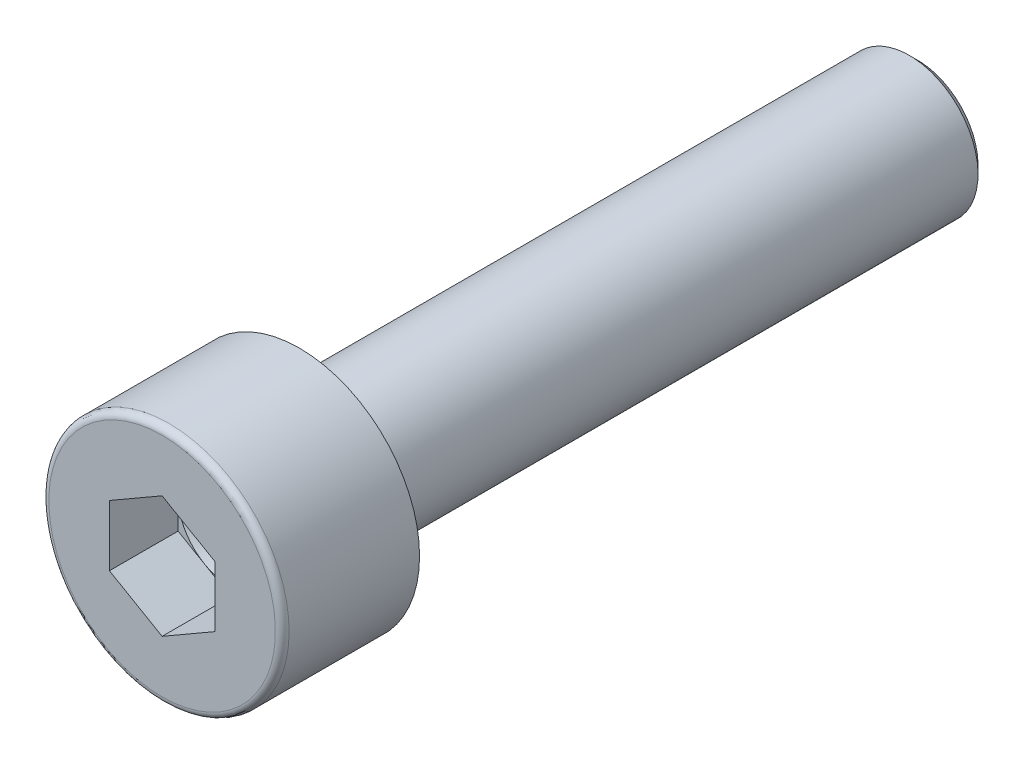
ISO-10303-21;
HEADER;
FILE_DESCRIPTION(('STEP AP214'),'2;1');
FILE_NAME('part.step','',(''),(''),'','','');
FILE_SCHEMA(('AUTOMOTIVE_DESIGN { 1 0 10303 214 1 1 1 1 }'));
ENDSEC;
DATA;
#1=APPLICATION_CONTEXT('core data for automotive mechanical design processes');
#2=APPLICATION_PROTOCOL_DEFINITION('international standard','automotive_design',2000,#1);
#3=PRODUCT_CONTEXT('',#1,'mechanical');
#4=PRODUCT('Part','Part','',(#3));
#5=PRODUCT_RELATED_PRODUCT_CATEGORY('part','',(#4));
#6=PRODUCT_DEFINITION_FORMATION('','',#4);
#7=PRODUCT_DEFINITION_CONTEXT('part definition',#1,'design');
#8=PRODUCT_DEFINITION('design','',#6,#7);
#9=PRODUCT_DEFINITION_SHAPE('','',#8);
#10=(LENGTH_UNIT() NAMED_UNIT(*) SI_UNIT(.MILLI.,.METRE.));
#11=(NAMED_UNIT(*) PLANE_ANGLE_UNIT() SI_UNIT($,.RADIAN.));
#12=(NAMED_UNIT(*) SI_UNIT($,.STERADIAN.) SOLID_ANGLE_UNIT());
#13=UNCERTAINTY_MEASURE_WITH_UNIT(LENGTH_MEASURE(1.E-05),#10,'distance_accuracy_value','');
#14=(GEOMETRIC_REPRESENTATION_CONTEXT(3) GLOBAL_UNCERTAINTY_ASSIGNED_CONTEXT((#13)) GLOBAL_UNIT_ASSIGNED_CONTEXT((#10,
#11,#12)) REPRESENTATION_CONTEXT('',''));
#15=CARTESIAN_POINT('',(0.,0.,0.));
#16=DIRECTION('',(0.,0.,1.));
#17=DIRECTION('',(1.,0.,0.));
#18=AXIS2_PLACEMENT_3D('',#15,#16,#17);
#19=CARTESIAN_POINT('',(0.,1.77304267668134,2.));
#20=DIRECTION('',(0.,0.,1.));
#21=DIRECTION('',(1.,0.,0.));
#22=AXIS2_PLACEMENT_3D('',#19,#20,#21);
#23=PLANE('',#22);
#24=DIRECTION('',(0.,-1.,0.));
#25=VECTOR('',#24,1.);
#26=CARTESIAN_POINT('',(-1.5355,0.886521338340671,2.));
#27=LINE('',#26,#25);
#28=CARTESIAN_POINT('',(-1.5355,0.886521338340671,2.));
#29=VERTEX_POINT('',#28);
#30=CARTESIAN_POINT('',(-1.5355,0.,2.));
#31=VERTEX_POINT('',#30);
#32=EDGE_CURVE('E145',#29,#31,#27,.T.);
#33=ORIENTED_EDGE('',*,*,#32,.T.);
#34=CARTESIAN_POINT('',(0.,0.,2.));
#35=DIRECTION('',(0.,0.,-1.));
#36=DIRECTION('',(-1.,0.,0.));
#37=AXIS2_PLACEMENT_3D('',#34,#35,#36);
#38=CIRCLE('',#37,1.5355);
#39=CARTESIAN_POINT('',(-0.76775,1.32978200751101,2.));
#40=VERTEX_POINT('',#39);
#41=EDGE_CURVE('E28',#31,#40,#38,.T.);
#42=ORIENTED_EDGE('',*,*,#41,.T.);
#43=DIRECTION('',(-0.866025403784439,-0.5,0.));
#44=VECTOR('',#43,1.);
#45=CARTESIAN_POINT('',(0.,1.77304267668134,2.));
#46=LINE('',#45,#44);
#47=EDGE_CURVE('E209',#40,#29,#46,.T.);
#48=ORIENTED_EDGE('',*,*,#47,.T.);
#49=EDGE_LOOP('',(#33,#42,#48));
#50=FACE_BOUND('',#49,.T.);
#51=ADVANCED_FACE('F17',(#50),#23,.T.);
#52=CARTESIAN_POINT('',(0.,1.77304267668134,2.));
#53=VERTEX_POINT('',#52);
#54=EDGE_CURVE('E214',#53,#40,#46,.T.);
#55=ORIENTED_EDGE('',*,*,#54,.T.);
#56=CARTESIAN_POINT('',(0.76775,1.32978200751101,2.));
#57=VERTEX_POINT('',#56);
#58=EDGE_CURVE('E11',#40,#57,#38,.T.);
#59=ORIENTED_EDGE('',*,*,#58,.T.);
#60=DIRECTION('',(-0.866025403784439,0.5,0.));
#61=VECTOR('',#60,1.);
#62=CARTESIAN_POINT('',(1.5355,0.886521338340671,2.));
#63=LINE('',#62,#61);
#64=EDGE_CURVE('E171',#57,#53,#63,.T.);
#65=ORIENTED_EDGE('',*,*,#64,.T.);
#66=EDGE_LOOP('',(#55,#59,#65));
#67=FACE_BOUND('',#66,.T.);
#68=ADVANCED_FACE('F106',(#67),#23,.T.);
#69=CARTESIAN_POINT('',(1.5355,0.886521338340671,2.));
#70=VERTEX_POINT('',#69);
#71=EDGE_CURVE('E215',#70,#57,#63,.T.);
#72=ORIENTED_EDGE('',*,*,#71,.T.);
#73=CARTESIAN_POINT('',(1.5355,0.,2.));
#74=VERTEX_POINT('',#73);
#75=EDGE_CURVE('E26',#57,#74,#38,.T.);
#76=ORIENTED_EDGE('',*,*,#75,.T.);
#77=DIRECTION('',(0.,1.,0.));
#78=VECTOR('',#77,1.);
#79=CARTESIAN_POINT('',(1.5355,-0.886521338340671,2.));
#80=LINE('',#79,#78);
#81=EDGE_CURVE('E150',#74,#70,#80,.T.);
#82=ORIENTED_EDGE('',*,*,#81,.T.);
#83=EDGE_LOOP('',(#72,#76,#82));
#84=FACE_BOUND('',#83,.T.);
#85=ADVANCED_FACE('F113',(#84),#23,.T.);
#86=CARTESIAN_POINT('',(1.5355,-0.886521338340671,2.));
#87=VERTEX_POINT('',#86);
#88=EDGE_CURVE('E151',#87,#74,#80,.T.);
#89=ORIENTED_EDGE('',*,*,#88,.T.);
#90=CARTESIAN_POINT('',(0.76775,-1.32978200751101,2.));
#91=VERTEX_POINT('',#90);
#92=EDGE_CURVE('E206',#74,#91,#38,.T.);
#93=ORIENTED_EDGE('',*,*,#92,.T.);
#94=DIRECTION('',(0.866025403784439,0.5,0.));
#95=VECTOR('',#94,1.);
#96=CARTESIAN_POINT('',(0.,-1.77304267668134,2.));
#97=LINE('',#96,#95);
#98=EDGE_CURVE('E140',#91,#87,#97,.T.);
#99=ORIENTED_EDGE('',*,*,#98,.T.);
#100=EDGE_LOOP('',(#89,#93,#99));
#101=FACE_BOUND('',#100,.T.);
#102=ADVANCED_FACE('F129',(#101),#23,.T.);
#103=CARTESIAN_POINT('',(0.,-1.77304267668134,2.));
#104=VERTEX_POINT('',#103);
#105=EDGE_CURVE('E143',#104,#91,#97,.T.);
#106=ORIENTED_EDGE('',*,*,#105,.T.);
#107=CARTESIAN_POINT('',(-0.76775,-1.329782007511,2.));
#108=VERTEX_POINT('',#107);
#109=EDGE_CURVE('E204',#91,#108,#38,.T.);
#110=ORIENTED_EDGE('',*,*,#109,.T.);
#111=DIRECTION('',(0.866025403784439,-0.5,0.));
#112=VECTOR('',#111,1.);
#113=CARTESIAN_POINT('',(-1.5355,-0.886521338340671,2.));
#114=LINE('',#113,#112);
#115=EDGE_CURVE('E141',#108,#104,#114,.T.);
#116=ORIENTED_EDGE('',*,*,#115,.T.);
#117=EDGE_LOOP('',(#106,#110,#116));
#118=FACE_BOUND('',#117,.T.);
#119=ADVANCED_FACE('F119',(#118),#23,.T.);
#120=CARTESIAN_POINT('',(-1.5355,-0.886521338340671,2.));
#121=VERTEX_POINT('',#120);
#122=EDGE_CURVE('E133',#121,#108,#114,.T.);
#123=ORIENTED_EDGE('',*,*,#122,.T.);
#124=EDGE_CURVE('E134',#108,#31,#38,.T.);
#125=ORIENTED_EDGE('',*,*,#124,.T.);
#126=EDGE_CURVE('E136',#31,#121,#27,.T.);
#127=ORIENTED_EDGE('',*,*,#126,.T.);
#128=EDGE_LOOP('',(#123,#125,#127));
#129=FACE_BOUND('',#128,.T.);
#130=ADVANCED_FACE('F108',(#129),#23,.T.);
#131=CARTESIAN_POINT('',(0.,0.,4.));
#132=DIRECTION('',(0.,0.,-1.));
#133=DIRECTION('',(0.,1.,0.));
#134=AXIS2_PLACEMENT_3D('',#131,#132,#133);
#135=PLANE('',#134);
#136=DIRECTION('',(-0.866025403784439,-0.5,0.));
#137=VECTOR('',#136,1.);
#138=CARTESIAN_POINT('',(0.,1.77304267668134,4.));
#139=LINE('',#138,#137);
#140=CARTESIAN_POINT('',(0.,1.77304267668134,4.));
#141=VERTEX_POINT('',#140);
#142=CARTESIAN_POINT('',(-1.5355,0.886521338340671,4.));
#143=VERTEX_POINT('',#142);
#144=EDGE_CURVE('E156',#141,#143,#139,.T.);
#145=ORIENTED_EDGE('',*,*,#144,.F.);
#146=DIRECTION('',(-0.866025403784439,0.5,0.));
#147=VECTOR('',#146,1.);
#148=CARTESIAN_POINT('',(1.5355,0.886521338340671,4.));
#149=LINE('',#148,#147);
#150=CARTESIAN_POINT('',(1.5355,0.886521338340671,4.));
#151=VERTEX_POINT('',#150);
#152=EDGE_CURVE('E42',#151,#141,#149,.T.);
#153=ORIENTED_EDGE('',*,*,#152,.F.);
#154=DIRECTION('',(0.,1.,0.));
#155=VECTOR('',#154,1.);
#156=CARTESIAN_POINT('',(1.5355,-0.886521338340671,4.));
#157=LINE('',#156,#155);
#158=CARTESIAN_POINT('',(1.5355,-0.886521338340671,4.));
#159=VERTEX_POINT('',#158);
#160=EDGE_CURVE('E168',#159,#151,#157,.T.);
#161=ORIENTED_EDGE('',*,*,#160,.F.);
#162=DIRECTION('',(0.866025403784439,0.5,0.));
#163=VECTOR('',#162,1.);
#164=CARTESIAN_POINT('',(0.,-1.77304267668134,4.));
#165=LINE('',#164,#163);
#166=CARTESIAN_POINT('',(0.,-1.77304267668134,4.));
#167=VERTEX_POINT('',#166);
#168=EDGE_CURVE('E165',#167,#159,#165,.T.);
#169=ORIENTED_EDGE('',*,*,#168,.F.);
#170=DIRECTION('',(0.866025403784439,-0.5,0.));
#171=VECTOR('',#170,1.);
#172=CARTESIAN_POINT('',(-1.5355,-0.886521338340671,4.));
#173=LINE('',#172,#171);
#174=CARTESIAN_POINT('',(-1.5355,-0.886521338340671,4.));
#175=VERTEX_POINT('',#174);
#176=EDGE_CURVE('E162',#175,#167,#173,.T.);
#177=ORIENTED_EDGE('',*,*,#176,.F.);
#178=DIRECTION('',(0.,-1.,0.));
#179=VECTOR('',#178,1.);
#180=CARTESIAN_POINT('',(-1.5355,0.886521338340671,4.));
#181=LINE('',#180,#179);
#182=EDGE_CURVE('E159',#143,#175,#181,.T.);
#183=ORIENTED_EDGE('',*,*,#182,.F.);
#184=EDGE_LOOP('',(#145,#153,#161,#169,#177,#183));
#185=FACE_BOUND('',#184,.T.);
#186=CARTESIAN_POINT('',(0.,0.,4.));
#187=DIRECTION('',(0.,0.,-1.));
#188=DIRECTION('',(0.,1.,0.));
#189=AXIS2_PLACEMENT_3D('',#186,#187,#188);
#190=CIRCLE('',#189,3.3);
#191=CARTESIAN_POINT('',(0.,3.3,4.));
#192=VERTEX_POINT('',#191);
#193=EDGE_CURVE('E192',#192,#192,#190,.F.);
#194=ORIENTED_EDGE('',*,*,#193,.T.);
#195=EDGE_LOOP('',(#194));
#196=FACE_BOUND('',#195,.T.);
#197=ADVANCED_FACE('F118',(#185,#196),#135,.F.);
#198=CARTESIAN_POINT('',(0.,0.,4.));
#199=DIRECTION('',(0.,0.,1.));
#200=DIRECTION('',(0.,-1.,0.));
#201=AXIS2_PLACEMENT_3D('',#198,#199,#200);
#202=CYLINDRICAL_SURFACE('',#201,3.5);
#203=CARTESIAN_POINT('',(0.,0.,3.8));
#204=DIRECTION('',(0.,0.,-1.));
#205=DIRECTION('',(0.,1.,0.));
#206=AXIS2_PLACEMENT_3D('',#203,#204,#205);
#207=CIRCLE('',#206,3.5);
#208=CARTESIAN_POINT('',(0.,3.5,3.8));
#209=VERTEX_POINT('',#208);
#210=EDGE_CURVE('E195',#209,#209,#207,.T.);
#211=ORIENTED_EDGE('',*,*,#210,.T.);
#212=EDGE_LOOP('',(#211));
#213=FACE_BOUND('',#212,.T.);
#214=CARTESIAN_POINT('',(0.,0.,0.));
#215=DIRECTION('',(0.,0.,1.));
#216=DIRECTION('',(0.,-1.,0.));
#217=AXIS2_PLACEMENT_3D('',#214,#215,#216);
#218=CIRCLE('',#217,3.5);
#219=CARTESIAN_POINT('',(0.,-3.5,0.));
#220=VERTEX_POINT('',#219);
#221=EDGE_CURVE('E174',#220,#220,#218,.T.);
#222=ORIENTED_EDGE('',*,*,#221,.T.);
#223=EDGE_LOOP('',(#222));
#224=FACE_BOUND('',#223,.T.);
#225=ADVANCED_FACE('F126',(#213,#224),#202,.T.);
#226=CARTESIAN_POINT('',(0.,3.5,0.));
#227=DIRECTION('',(0.,0.,1.));
#228=DIRECTION('',(0.,-1.,0.));
#229=AXIS2_PLACEMENT_3D('',#226,#227,#228);
#230=PLANE('',#229);
#231=CARTESIAN_POINT('',(0.,0.,0.));
#232=DIRECTION('',(0.,0.,1.));
#233=DIRECTION('',(0.,-1.,0.));
#234=AXIS2_PLACEMENT_3D('',#231,#232,#233);
#235=CIRCLE('',#234,2.2);
#236=CARTESIAN_POINT('',(0.,-2.2,0.));
#237=VERTEX_POINT('',#236);
#238=EDGE_CURVE('E197',#237,#237,#235,.T.);
#239=ORIENTED_EDGE('',*,*,#238,.T.);
#240=EDGE_LOOP('',(#239));
#241=FACE_BOUND('',#240,.T.);
#242=ORIENTED_EDGE('',*,*,#221,.F.);
#243=EDGE_LOOP('',(#242));
#244=FACE_BOUND('',#243,.T.);
#245=ADVANCED_FACE('F264',(#241,#244),#230,.F.);
#246=CARTESIAN_POINT('',(0.,0.,4.));
#247=DIRECTION('',(0.,0.,1.));
#248=DIRECTION('',(0.,-1.,0.));
#249=AXIS2_PLACEMENT_3D('',#246,#247,#248);
#250=CYLINDRICAL_SURFACE('',#249,2.);
#251=CARTESIAN_POINT('',(0.,0.,-0.2));
#252=DIRECTION('',(0.,0.,1.));
#253=DIRECTION('',(0.,-1.,0.));
#254=AXIS2_PLACEMENT_3D('',#251,#252,#253);
#255=CIRCLE('',#254,2.);
#256=CARTESIAN_POINT('',(0.,-2.,-0.2));
#257=VERTEX_POINT('',#256);
#258=EDGE_CURVE('E21',#257,#257,#255,.F.);
#259=ORIENTED_EDGE('',*,*,#258,.T.);
#260=EDGE_LOOP('',(#259));
#261=FACE_BOUND('',#260,.T.);
#262=CARTESIAN_POINT('',(0.,0.,-17.77));
#263=DIRECTION('',(0.,0.,1.));
#264=DIRECTION('',(0.,-1.,0.));
#265=AXIS2_PLACEMENT_3D('',#262,#263,#264);
#266=CIRCLE('',#265,2.);
#267=CARTESIAN_POINT('',(0.,-2.,-17.77));
#268=VERTEX_POINT('',#267);
#269=EDGE_CURVE('E186',#268,#268,#266,.T.);
#270=ORIENTED_EDGE('',*,*,#269,.T.);
#271=EDGE_LOOP('',(#270));
#272=FACE_BOUND('',#271,.T.);
#273=ADVANCED_FACE('F260',(#261,#272),#250,.T.);
#274=CARTESIAN_POINT('',(0.,2.,-18.));
#275=DIRECTION('',(0.,0.,1.));
#276=DIRECTION('',(0.,-1.,0.));
#277=AXIS2_PLACEMENT_3D('',#274,#275,#276);
#278=PLANE('',#277);
#279=CARTESIAN_POINT('',(0.,0.,-18.));
#280=DIRECTION('',(0.,0.,1.));
#281=DIRECTION('',(0.,-1.,0.));
#282=AXIS2_PLACEMENT_3D('',#279,#280,#281);
#283=CIRCLE('',#282,1.77);
#284=CARTESIAN_POINT('',(0.,-1.77,-18.));
#285=VERTEX_POINT('',#284);
#286=EDGE_CURVE('E189',#285,#285,#283,.F.);
#287=ORIENTED_EDGE('',*,*,#286,.T.);
#288=EDGE_LOOP('',(#287));
#289=FACE_BOUND('',#288,.T.);
#290=ADVANCED_FACE('F256',(#289),#278,.F.);
#291=CARTESIAN_POINT('',(0.,0.,-17.77));
#292=DIRECTION('',(0.,0.,1.));
#293=DIRECTION('',(0.,-1.,0.));
#294=AXIS2_PLACEMENT_3D('',#291,#292,#293);
#295=CONICAL_SURFACE('',#294,2.,0.785398163397437);
#296=ORIENTED_EDGE('',*,*,#286,.F.);
#297=EDGE_LOOP('',(#296));
#298=FACE_BOUND('',#297,.T.);
#299=ORIENTED_EDGE('',*,*,#269,.F.);
#300=EDGE_LOOP('',(#299));
#301=FACE_BOUND('',#300,.T.);
#302=ADVANCED_FACE('F259',(#298,#301),#295,.T.);
#303=CARTESIAN_POINT('',(0.,0.,3.8));
#304=DIRECTION('',(0.,0.,-1.));
#305=DIRECTION('',(0.,1.,0.));
#306=AXIS2_PLACEMENT_3D('',#303,#304,#305);
#307=TOROIDAL_SURFACE('',#306,3.3,0.2);
#308=ORIENTED_EDGE('',*,*,#210,.F.);
#309=EDGE_LOOP('',(#308));
#310=FACE_BOUND('',#309,.T.);
#311=ORIENTED_EDGE('',*,*,#193,.F.);
#312=EDGE_LOOP('',(#311));
#313=FACE_BOUND('',#312,.T.);
#314=ADVANCED_FACE('F271',(#310,#313),#307,.T.);
#315=CARTESIAN_POINT('',(0.,0.,-0.2));
#316=DIRECTION('',(0.,0.,1.));
#317=DIRECTION('',(0.,-1.,0.));
#318=AXIS2_PLACEMENT_3D('',#315,#316,#317);
#319=TOROIDAL_SURFACE('',#318,2.2,0.2);
#320=ORIENTED_EDGE('',*,*,#258,.F.);
#321=EDGE_LOOP('',(#320));
#322=FACE_BOUND('',#321,.T.);
#323=ORIENTED_EDGE('',*,*,#238,.F.);
#324=EDGE_LOOP('',(#323));
#325=FACE_BOUND('',#324,.T.);
#326=ADVANCED_FACE('F19',(#322,#325),#319,.F.);
#327=CARTESIAN_POINT('',(1.5355,0.886521338340671,2.));
#328=DIRECTION('',(0.5,0.866025403784439,0.));
#329=DIRECTION('',(-0.866025403784439,0.5,0.));
#330=AXIS2_PLACEMENT_3D('',#327,#328,#329);
#331=PLANE('',#330);
#332=ORIENTED_EDGE('',*,*,#152,.T.);
#333=DIRECTION('',(0.,0.,1.));
#334=VECTOR('',#333,1.);
#335=CARTESIAN_POINT('',(0.,1.77304267668134,2.));
#336=LINE('',#335,#334);
#337=EDGE_CURVE('E154',#53,#141,#336,.T.);
#338=ORIENTED_EDGE('',*,*,#337,.F.);
#339=ORIENTED_EDGE('',*,*,#64,.F.);
#340=ORIENTED_EDGE('',*,*,#71,.F.);
#341=DIRECTION('',(0.,0.,1.));
#342=VECTOR('',#341,1.);
#343=CARTESIAN_POINT('',(1.5355,0.886521338340671,2.));
#344=LINE('',#343,#342);
#345=EDGE_CURVE('E172',#70,#151,#344,.T.);
#346=ORIENTED_EDGE('',*,*,#345,.T.);
#347=EDGE_LOOP('',(#332,#338,#339,#340,#346));
#348=FACE_BOUND('',#347,.T.);
#349=ADVANCED_FACE('F223',(#348),#331,.F.);
#350=CARTESIAN_POINT('',(1.5355,-0.886521338340671,2.));
#351=DIRECTION('',(1.,0.,0.));
#352=DIRECTION('',(0.,1.,0.));
#353=AXIS2_PLACEMENT_3D('',#350,#351,#352);
#354=PLANE('',#353);
#355=ORIENTED_EDGE('',*,*,#160,.T.);
#356=ORIENTED_EDGE('',*,*,#345,.F.);
#357=ORIENTED_EDGE('',*,*,#81,.F.);
#358=ORIENTED_EDGE('',*,*,#88,.F.);
#359=DIRECTION('',(0.,0.,1.));
#360=VECTOR('',#359,1.);
#361=CARTESIAN_POINT('',(1.5355,-0.886521338340671,2.));
#362=LINE('',#361,#360);
#363=EDGE_CURVE('E175',#87,#159,#362,.T.);
#364=ORIENTED_EDGE('',*,*,#363,.T.);
#365=EDGE_LOOP('',(#355,#356,#357,#358,#364));
#366=FACE_BOUND('',#365,.T.);
#367=ADVANCED_FACE('F242',(#366),#354,.F.);
#368=CARTESIAN_POINT('',(0.,-1.77304267668134,2.));
#369=DIRECTION('',(0.5,-0.866025403784439,0.));
#370=DIRECTION('',(0.866025403784439,0.5,0.));
#371=AXIS2_PLACEMENT_3D('',#368,#369,#370);
#372=PLANE('',#371);
#373=ORIENTED_EDGE('',*,*,#168,.T.);
#374=ORIENTED_EDGE('',*,*,#363,.F.);
#375=ORIENTED_EDGE('',*,*,#98,.F.);
#376=ORIENTED_EDGE('',*,*,#105,.F.);
#377=DIRECTION('',(0.,0.,1.));
#378=VECTOR('',#377,1.);
#379=CARTESIAN_POINT('',(0.,-1.77304267668134,2.));
#380=LINE('',#379,#378);
#381=EDGE_CURVE('E177',#104,#167,#380,.T.);
#382=ORIENTED_EDGE('',*,*,#381,.T.);
#383=EDGE_LOOP('',(#373,#374,#375,#376,#382));
#384=FACE_BOUND('',#383,.T.);
#385=ADVANCED_FACE('F236',(#384),#372,.F.);
#386=CARTESIAN_POINT('',(-1.5355,-0.886521338340671,2.));
#387=DIRECTION('',(-0.5,-0.866025403784439,0.));
#388=DIRECTION('',(0.866025403784439,-0.5,0.));
#389=AXIS2_PLACEMENT_3D('',#386,#387,#388);
#390=PLANE('',#389);
#391=ORIENTED_EDGE('',*,*,#176,.T.);
#392=ORIENTED_EDGE('',*,*,#381,.F.);
#393=ORIENTED_EDGE('',*,*,#115,.F.);
#394=ORIENTED_EDGE('',*,*,#122,.F.);
#395=DIRECTION('',(0.,0.,1.));
#396=VECTOR('',#395,1.);
#397=CARTESIAN_POINT('',(-1.5355,-0.886521338340671,2.));
#398=LINE('',#397,#396);
#399=EDGE_CURVE('E179',#121,#175,#398,.T.);
#400=ORIENTED_EDGE('',*,*,#399,.T.);
#401=EDGE_LOOP('',(#391,#392,#393,#394,#400));
#402=FACE_BOUND('',#401,.T.);
#403=ADVANCED_FACE('F231',(#402),#390,.F.);
#404=CARTESIAN_POINT('',(-1.5355,0.886521338340671,2.));
#405=DIRECTION('',(-1.,0.,0.));
#406=DIRECTION('',(0.,0.,1.));
#407=AXIS2_PLACEMENT_3D('',#404,#405,#406);
#408=PLANE('',#407);
#409=ORIENTED_EDGE('',*,*,#182,.T.);
#410=ORIENTED_EDGE('',*,*,#399,.F.);
#411=ORIENTED_EDGE('',*,*,#126,.F.);
#412=ORIENTED_EDGE('',*,*,#32,.F.);
#413=DIRECTION('',(0.,0.,1.));
#414=VECTOR('',#413,1.);
#415=CARTESIAN_POINT('',(-1.5355,0.886521338340671,2.));
#416=LINE('',#415,#414);
#417=EDGE_CURVE('E181',#29,#143,#416,.T.);
#418=ORIENTED_EDGE('',*,*,#417,.T.);
#419=EDGE_LOOP('',(#409,#410,#411,#412,#418));
#420=FACE_BOUND('',#419,.T.);
#421=ADVANCED_FACE('F101',(#420),#408,.F.);
#422=CARTESIAN_POINT('',(0.,1.77304267668134,2.));
#423=DIRECTION('',(-0.5,0.866025403784439,0.));
#424=DIRECTION('',(-0.866025403784439,-0.5,0.));
#425=AXIS2_PLACEMENT_3D('',#422,#423,#424);
#426=PLANE('',#425);
#427=ORIENTED_EDGE('',*,*,#144,.T.);
#428=ORIENTED_EDGE('',*,*,#417,.F.);
#429=ORIENTED_EDGE('',*,*,#47,.F.);
#430=ORIENTED_EDGE('',*,*,#54,.F.);
#431=ORIENTED_EDGE('',*,*,#337,.T.);
#432=EDGE_LOOP('',(#427,#428,#429,#430,#431));
#433=FACE_BOUND('',#432,.T.);
#434=ADVANCED_FACE('F94',(#433),#426,.F.);
#435=CARTESIAN_POINT('',(0.,0.,1.11347866165933));
#436=DIRECTION('',(0.,0.,1.));
#437=DIRECTION('',(1.,0.,0.));
#438=AXIS2_PLACEMENT_3D('',#435,#436,#437);
#439=CONICAL_SURFACE('',#438,0.,1.0471975511966);
#440=ORIENTED_EDGE('',*,*,#41,.F.);
#441=ORIENTED_EDGE('',*,*,#124,.F.);
#442=ORIENTED_EDGE('',*,*,#109,.F.);
#443=ORIENTED_EDGE('',*,*,#92,.F.);
#444=ORIENTED_EDGE('',*,*,#75,.F.);
#445=ORIENTED_EDGE('',*,*,#58,.F.);
#446=EDGE_LOOP('',(#440,#441,#442,#443,#444,#445));
#447=FACE_BOUND('',#446,.T.);
#448=CARTESIAN_POINT('',(0.,0.,1.11347866165933));
#449=VERTEX_POINT('',#448);
#450=VERTEX_LOOP('',#449);
#451=FACE_BOUND('',#450,.T.);
#452=ADVANCED_FACE('F92',(#447,#451),#439,.F.);
#453=CLOSED_SHELL('',(#51,#68,#85,#102,#119,#130,#197,#225,#245,#273,#290,#302,#314,#326,#349,
#367,#385,#403,#421,#434,#452));
#454=MANIFOLD_SOLID_BREP('B1',#453);
#455=ADVANCED_BREP_SHAPE_REPRESENTATION('',(#18,#454),#14);
#456=SHAPE_DEFINITION_REPRESENTATION(#9,#455);
ENDSEC;
END-ISO-10303-21;
